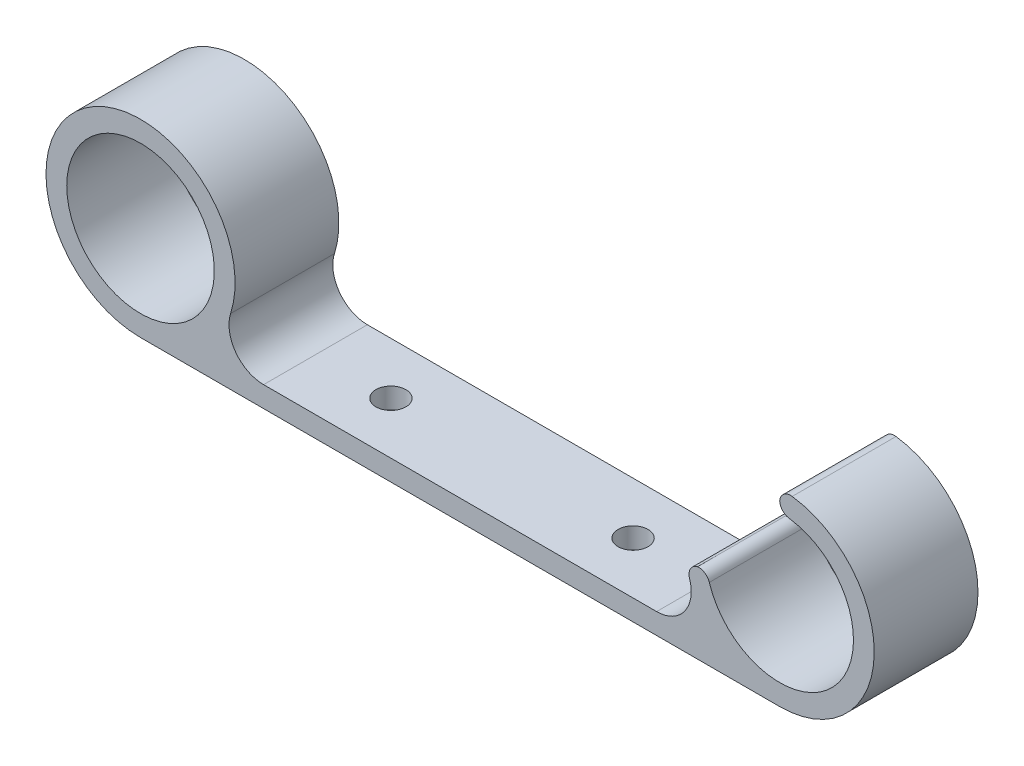
ISO-10303-21;
HEADER;
FILE_DESCRIPTION(('STEP AP214'),'2;1');
FILE_NAME('part.step','',(''),(''),'','','');
FILE_SCHEMA(('AUTOMOTIVE_DESIGN { 1 0 10303 214 1 1 1 1 }'));
ENDSEC;
DATA;
#1=APPLICATION_CONTEXT('core data for automotive mechanical design processes');
#2=APPLICATION_PROTOCOL_DEFINITION('international standard','automotive_design',2000,#1);
#3=PRODUCT_CONTEXT('',#1,'mechanical');
#4=PRODUCT('Part','Part','',(#3));
#5=PRODUCT_RELATED_PRODUCT_CATEGORY('part','',(#4));
#6=PRODUCT_DEFINITION_FORMATION('','',#4);
#7=PRODUCT_DEFINITION_CONTEXT('part definition',#1,'design');
#8=PRODUCT_DEFINITION('design','',#6,#7);
#9=PRODUCT_DEFINITION_SHAPE('','',#8);
#10=(LENGTH_UNIT() NAMED_UNIT(*) SI_UNIT(.MILLI.,.METRE.));
#11=(NAMED_UNIT(*) PLANE_ANGLE_UNIT() SI_UNIT($,.RADIAN.));
#12=(NAMED_UNIT(*) SI_UNIT($,.STERADIAN.) SOLID_ANGLE_UNIT());
#13=UNCERTAINTY_MEASURE_WITH_UNIT(LENGTH_MEASURE(1.E-05),#10,'distance_accuracy_value','');
#14=(GEOMETRIC_REPRESENTATION_CONTEXT(3) GLOBAL_UNCERTAINTY_ASSIGNED_CONTEXT((#13)) GLOBAL_UNIT_ASSIGNED_CONTEXT((#10,
#11,#12)) REPRESENTATION_CONTEXT('',''));
#15=CARTESIAN_POINT('',(0.,0.,0.));
#16=DIRECTION('',(0.,0.,1.));
#17=DIRECTION('',(1.,0.,0.));
#18=AXIS2_PLACEMENT_3D('',#15,#16,#17);
#19=CARTESIAN_POINT('',(58.658787305,17.3553125,9.525));
#20=DIRECTION('',(0.,0.,-1.));
#21=DIRECTION('',(-1.,0.,0.));
#22=AXIS2_PLACEMENT_3D('',#19,#20,#21);
#23=CYLINDRICAL_SURFACE('',#22,17.3553125);
#24=CARTESIAN_POINT('',(58.658787305,17.3553125,-9.525));
#25=DIRECTION('',(0.,0.,1.));
#26=DIRECTION('',(1.,0.,0.));
#27=AXIS2_PLACEMENT_3D('',#24,#25,#26);
#28=CIRCLE('',#27,17.3553125);
#29=CARTESIAN_POINT('',(60.9602475799895,34.5573516981678,-9.525));
#30=VERTEX_POINT('',#29);
#31=CARTESIAN_POINT('',(58.658787305,0.,-9.525));
#32=VERTEX_POINT('',#31);
#33=EDGE_CURVE('E263',#30,#32,#28,.F.);
#34=ORIENTED_EDGE('',*,*,#33,.F.);
#35=DIRECTION('',(0.,0.,-1.));
#36=VECTOR('',#35,1.);
#37=CARTESIAN_POINT('',(60.9602475799895,34.5573516981678,9.525));
#38=LINE('',#37,#36);
#39=CARTESIAN_POINT('',(60.9602475799895,34.5573516981678,9.525));
#40=VERTEX_POINT('',#39);
#41=EDGE_CURVE('E191',#30,#40,#38,.F.);
#42=ORIENTED_EDGE('',*,*,#41,.T.);
#43=CARTESIAN_POINT('',(58.658787305,17.3553125,9.525));
#44=DIRECTION('',(0.,0.,1.));
#45=DIRECTION('',(1.,0.,0.));
#46=AXIS2_PLACEMENT_3D('',#43,#44,#45);
#47=CIRCLE('',#46,17.3553125);
#48=CARTESIAN_POINT('',(58.658787305,0.,9.525));
#49=VERTEX_POINT('',#48);
#50=EDGE_CURVE('E159',#40,#49,#47,.F.);
#51=ORIENTED_EDGE('',*,*,#50,.T.);
#52=DIRECTION('',(0.,0.,-1.));
#53=VECTOR('',#52,1.);
#54=CARTESIAN_POINT('',(58.658787305,0.,9.525));
#55=LINE('',#54,#53);
#56=EDGE_CURVE('E143',#49,#32,#55,.T.);
#57=ORIENTED_EDGE('',*,*,#56,.T.);
#58=EDGE_LOOP('',(#34,#42,#51,#57));
#59=FACE_BOUND('',#58,.T.);
#60=ADVANCED_FACE('F44',(#59),#23,.T.);
#61=CARTESIAN_POINT('',(58.658787305,17.3553125,9.525));
#62=DIRECTION('',(0.,0.,-1.));
#63=DIRECTION('',(-1.,0.,0.));
#64=AXIS2_PLACEMENT_3D('',#61,#62,#63);
#65=CYLINDRICAL_SURFACE('',#64,13.5453125);
#66=CARTESIAN_POINT('',(58.658787305,17.3553125,9.525));
#67=DIRECTION('',(0.,0.,1.));
#68=DIRECTION('',(1.,0.,0.));
#69=AXIS2_PLACEMENT_3D('',#66,#67,#68);
#70=CIRCLE('',#69,13.5453125);
#71=CARTESIAN_POINT('',(45.7400642600769,13.2832017928568,9.525));
#72=VERTEX_POINT('',#71);
#73=CARTESIAN_POINT('',(60.425720785984,30.7848857172111,9.525));
#74=VERTEX_POINT('',#73);
#75=EDGE_CURVE('E243',#72,#74,#70,.T.);
#76=ORIENTED_EDGE('',*,*,#75,.T.);
#77=DIRECTION('',(0.,0.,-1.));
#78=VECTOR('',#77,1.);
#79=CARTESIAN_POINT('',(60.425720785984,30.7848857172111,9.525));
#80=LINE('',#79,#78);
#81=CARTESIAN_POINT('',(60.425720785984,30.7848857172111,-9.525));
#82=VERTEX_POINT('',#81);
#83=EDGE_CURVE('E54',#74,#82,#80,.T.);
#84=ORIENTED_EDGE('',*,*,#83,.T.);
#85=CARTESIAN_POINT('',(58.658787305,17.3553125,-9.525));
#86=DIRECTION('',(0.,0.,1.));
#87=DIRECTION('',(1.,0.,0.));
#88=AXIS2_PLACEMENT_3D('',#85,#86,#87);
#89=CIRCLE('',#88,13.5453125);
#90=CARTESIAN_POINT('',(45.7400642600769,13.2832017928568,-9.525));
#91=VERTEX_POINT('',#90);
#92=EDGE_CURVE('E266',#91,#82,#89,.T.);
#93=ORIENTED_EDGE('',*,*,#92,.F.);
#94=DIRECTION('',(0.,0.,-1.));
#95=VECTOR('',#94,1.);
#96=CARTESIAN_POINT('',(45.7400642600769,13.2832017928568,9.525));
#97=LINE('',#96,#95);
#98=EDGE_CURVE('E205',#91,#72,#97,.F.);
#99=ORIENTED_EDGE('',*,*,#98,.T.);
#100=EDGE_LOOP('',(#76,#84,#93,#99));
#101=FACE_BOUND('',#100,.T.);
#102=ADVANCED_FACE('F315',(#101),#65,.F.);
#103=CARTESIAN_POINT('',(58.658787305,17.3553125,9.525));
#104=DIRECTION('',(0.,0.,-1.));
#105=DIRECTION('',(-1.,0.,0.));
#106=AXIS2_PLACEMENT_3D('',#103,#104,#105);
#107=CYLINDRICAL_SURFACE('',#106,17.3553125);
#108=CARTESIAN_POINT('',(58.658787305,17.3553125,9.525));
#109=DIRECTION('',(0.,0.,1.));
#110=DIRECTION('',(1.,0.,0.));
#111=AXIS2_PLACEMENT_3D('',#108,#109,#110);
#112=CIRCLE('',#111,17.3553125);
#113=CARTESIAN_POINT('',(42.1222748785896,12.0874259461882,9.525));
#114=VERTEX_POINT('',#113);
#115=CARTESIAN_POINT('',(42.1177301177492,12.1017138190237,9.525));
#116=VERTEX_POINT('',#115);
#117=EDGE_CURVE('E247',#114,#116,#112,.F.);
#118=ORIENTED_EDGE('',*,*,#117,.T.);
#119=DIRECTION('',(0.,0.,-1.));
#120=VECTOR('',#119,1.);
#121=CARTESIAN_POINT('',(42.1177301177492,12.1017138190237,9.525));
#122=LINE('',#121,#120);
#123=CARTESIAN_POINT('',(42.1177301177492,12.1017138190237,-9.525));
#124=VERTEX_POINT('',#123);
#125=EDGE_CURVE('E11',#116,#124,#122,.T.);
#126=ORIENTED_EDGE('',*,*,#125,.T.);
#127=CARTESIAN_POINT('',(58.658787305,17.3553125,-9.525));
#128=DIRECTION('',(0.,0.,1.));
#129=DIRECTION('',(1.,0.,0.));
#130=AXIS2_PLACEMENT_3D('',#127,#128,#129);
#131=CIRCLE('',#130,17.3553125);
#132=CARTESIAN_POINT('',(42.1222748785896,12.0874259461882,-9.525));
#133=VERTEX_POINT('',#132);
#134=EDGE_CURVE('E270',#133,#124,#131,.F.);
#135=ORIENTED_EDGE('',*,*,#134,.F.);
#136=DIRECTION('',(0.,0.,-1.));
#137=VECTOR('',#136,1.);
#138=CARTESIAN_POINT('',(42.1222748785896,12.0874259461882,9.525));
#139=LINE('',#138,#137);
#140=EDGE_CURVE('E170',#114,#133,#139,.T.);
#141=ORIENTED_EDGE('',*,*,#140,.F.);
#142=EDGE_LOOP('',(#118,#126,#135,#141));
#143=FACE_BOUND('',#142,.T.);
#144=ADVANCED_FACE('F298',(#143),#107,.T.);
#145=CARTESIAN_POINT('',(36.0718592546874,10.16,9.525));
#146=DIRECTION('',(0.,0.,-1.));
#147=DIRECTION('',(-1.,0.,0.));
#148=AXIS2_PLACEMENT_3D('',#145,#146,#147);
#149=CYLINDRICAL_SURFACE('',#148,6.35);
#150=CARTESIAN_POINT('',(36.0718592546874,10.16,-9.525));
#151=DIRECTION('',(0.,0.,1.));
#152=DIRECTION('',(1.,0.,0.));
#153=AXIS2_PLACEMENT_3D('',#150,#151,#152);
#154=CIRCLE('',#153,6.35);
#155=CARTESIAN_POINT('',(36.0718592546874,3.81,-9.525));
#156=VERTEX_POINT('',#155);
#157=EDGE_CURVE('E274',#156,#133,#154,.T.);
#158=ORIENTED_EDGE('',*,*,#157,.F.);
#159=DIRECTION('',(0.,0.,-1.));
#160=VECTOR('',#159,1.);
#161=CARTESIAN_POINT('',(36.0718592546874,3.81,9.525));
#162=LINE('',#161,#160);
#163=CARTESIAN_POINT('',(36.0718592546874,3.81,9.525));
#164=VERTEX_POINT('',#163);
#165=EDGE_CURVE('E286',#164,#156,#162,.T.);
#166=ORIENTED_EDGE('',*,*,#165,.F.);
#167=CARTESIAN_POINT('',(36.0718592546874,10.16,9.525));
#168=DIRECTION('',(0.,0.,1.));
#169=DIRECTION('',(1.,0.,0.));
#170=AXIS2_PLACEMENT_3D('',#167,#168,#169);
#171=CIRCLE('',#170,6.35);
#172=EDGE_CURVE('E251',#164,#114,#171,.T.);
#173=ORIENTED_EDGE('',*,*,#172,.T.);
#174=ORIENTED_EDGE('',*,*,#140,.T.);
#175=EDGE_LOOP('',(#158,#166,#173,#174));
#176=FACE_BOUND('',#175,.T.);
#177=ADVANCED_FACE('F293',(#176),#149,.F.);
#178=CARTESIAN_POINT('',(0.,3.81,0.));
#179=DIRECTION('',(0.,-1.,0.));
#180=DIRECTION('',(0.,0.,-1.));
#181=AXIS2_PLACEMENT_3D('',#178,#179,#180);
#182=PLANE('',#181);
#183=CARTESIAN_POINT('',(-22.225,3.81,0.));
#184=DIRECTION('',(0.,1.,0.));
#185=DIRECTION('',(0.,0.,1.));
#186=AXIS2_PLACEMENT_3D('',#183,#184,#185);
#187=CIRCLE('',#186,2.75);
#188=CARTESIAN_POINT('',(-22.225,3.81,2.75));
#189=VERTEX_POINT('',#188);
#190=EDGE_CURVE('E222',#189,#189,#187,.T.);
#191=ORIENTED_EDGE('',*,*,#190,.F.);
#192=EDGE_LOOP('',(#191));
#193=FACE_BOUND('',#192,.T.);
#194=CARTESIAN_POINT('',(22.225,3.81,0.));
#195=DIRECTION('',(0.,1.,0.));
#196=DIRECTION('',(0.,0.,-1.));
#197=AXIS2_PLACEMENT_3D('',#194,#195,#196);
#198=CIRCLE('',#197,2.75);
#199=CARTESIAN_POINT('',(22.225,3.81,2.75));
#200=VERTEX_POINT('',#199);
#201=EDGE_CURVE('E229',#200,#200,#198,.T.);
#202=ORIENTED_EDGE('',*,*,#201,.F.);
#203=EDGE_LOOP('',(#202));
#204=FACE_BOUND('',#203,.T.);
#205=ORIENTED_EDGE('',*,*,#165,.T.);
#206=DIRECTION('',(-1.,0.,0.));
#207=VECTOR('',#206,1.);
#208=CARTESIAN_POINT('',(-57.15,3.81,-9.525));
#209=LINE('',#208,#207);
#210=CARTESIAN_POINT('',(-36.0718592546874,3.81,-9.525));
#211=VERTEX_POINT('',#210);
#212=EDGE_CURVE('E145',#156,#211,#209,.T.);
#213=ORIENTED_EDGE('',*,*,#212,.T.);
#214=DIRECTION('',(0.,0.,-1.));
#215=VECTOR('',#214,1.);
#216=CARTESIAN_POINT('',(-36.0718592546874,3.81,9.525));
#217=LINE('',#216,#215);
#218=CARTESIAN_POINT('',(-36.0718592546874,3.81,9.525));
#219=VERTEX_POINT('',#218);
#220=EDGE_CURVE('E282',#219,#211,#217,.T.);
#221=ORIENTED_EDGE('',*,*,#220,.F.);
#222=DIRECTION('',(1.,0.,0.));
#223=VECTOR('',#222,1.);
#224=CARTESIAN_POINT('',(-57.15,3.81,9.525));
#225=LINE('',#224,#223);
#226=EDGE_CURVE('E176',#219,#164,#225,.T.);
#227=ORIENTED_EDGE('',*,*,#226,.T.);
#228=EDGE_LOOP('',(#205,#213,#221,#227));
#229=FACE_BOUND('',#228,.T.);
#230=ADVANCED_FACE('F306',(#193,#204,#229),#182,.F.);
#231=CARTESIAN_POINT('',(-57.15,3.81,-9.525));
#232=DIRECTION('',(0.,0.,1.));
#233=DIRECTION('',(1.,0.,0.));
#234=AXIS2_PLACEMENT_3D('',#231,#232,#233);
#235=PLANE('',#234);
#236=CARTESIAN_POINT('',(60.690787305,32.7995230891708,-9.525));
#237=DIRECTION('',(0.,0.,1.));
#238=DIRECTION('',(1.,0.,0.));
#239=AXIS2_PLACEMENT_3D('',#236,#237,#238);
#240=CIRCLE('',#239,2.032);
#241=CARTESIAN_POINT('',(58.6628299373703,32.6714101894436,-9.525));
#242=VERTEX_POINT('',#241);
#243=EDGE_CURVE('E185',#82,#242,#240,.F.);
#244=ORIENTED_EDGE('',*,*,#243,.T.);
#245=CARTESIAN_POINT('',(60.690787305,32.5432972897164,-9.525));
#246=DIRECTION('',(0.,0.,1.));
#247=DIRECTION('',(1.,0.,0.));
#248=AXIS2_PLACEMENT_3D('',#245,#246,#247);
#249=CIRCLE('',#248,2.032);
#250=EDGE_CURVE('E188',#242,#30,#249,.F.);
#251=ORIENTED_EDGE('',*,*,#250,.T.);
#252=ORIENTED_EDGE('',*,*,#33,.T.);
#253=DIRECTION('',(-1.,0.,0.));
#254=VECTOR('',#253,1.);
#255=CARTESIAN_POINT('',(-57.15,0.,-9.525));
#256=LINE('',#255,#254);
#257=CARTESIAN_POINT('',(-58.658787305,0.,-9.525));
#258=VERTEX_POINT('',#257);
#259=EDGE_CURVE('E146',#32,#258,#256,.T.);
#260=ORIENTED_EDGE('',*,*,#259,.T.);
#261=CARTESIAN_POINT('',(-58.658787305,17.3553125,-9.525));
#262=DIRECTION('',(0.,0.,1.));
#263=DIRECTION('',(1.,0.,0.));
#264=AXIS2_PLACEMENT_3D('',#261,#262,#263);
#265=CIRCLE('',#264,17.3553125);
#266=CARTESIAN_POINT('',(-42.1222748785896,12.0874259461882,-9.525));
#267=VERTEX_POINT('',#266);
#268=EDGE_CURVE('E164',#267,#258,#265,.T.);
#269=ORIENTED_EDGE('',*,*,#268,.F.);
#270=CARTESIAN_POINT('',(-36.0718592546874,10.16,-9.525));
#271=DIRECTION('',(0.,0.,1.));
#272=DIRECTION('',(1.,0.,0.));
#273=AXIS2_PLACEMENT_3D('',#270,#271,#272);
#274=CIRCLE('',#273,6.35);
#275=EDGE_CURVE('E239',#211,#267,#274,.F.);
#276=ORIENTED_EDGE('',*,*,#275,.F.);
#277=ORIENTED_EDGE('',*,*,#212,.F.);
#278=ORIENTED_EDGE('',*,*,#157,.T.);
#279=ORIENTED_EDGE('',*,*,#134,.T.);
#280=CARTESIAN_POINT('',(44.054395228475,12.7168172647118,-9.525));
#281=DIRECTION('',(0.,0.,1.));
#282=DIRECTION('',(1.,0.,0.));
#283=AXIS2_PLACEMENT_3D('',#280,#281,#282);
#284=CIRCLE('',#283,2.032);
#285=CARTESIAN_POINT('',(43.5760775502877,14.6917188315585,-9.525));
#286=VERTEX_POINT('',#285);
#287=EDGE_CURVE('E178',#124,#286,#284,.F.);
#288=ORIENTED_EDGE('',*,*,#287,.T.);
#289=CARTESIAN_POINT('',(43.8020620746505,12.6723241215653,-9.525));
#290=DIRECTION('',(0.,0.,1.));
#291=DIRECTION('',(1.,0.,0.));
#292=AXIS2_PLACEMENT_3D('',#289,#290,#291);
#293=CIRCLE('',#292,2.032);
#294=EDGE_CURVE('E182',#286,#91,#293,.F.);
#295=ORIENTED_EDGE('',*,*,#294,.T.);
#296=ORIENTED_EDGE('',*,*,#92,.T.);
#297=EDGE_LOOP('',(#244,#251,#252,#260,#269,#276,#277,#278,#279,#288,#295,#296));
#298=FACE_BOUND('',#297,.T.);
#299=CARTESIAN_POINT('',(-58.658787305,17.3553125,-9.525));
#300=DIRECTION('',(0.,0.,1.));
#301=DIRECTION('',(1.,0.,0.));
#302=AXIS2_PLACEMENT_3D('',#299,#300,#301);
#303=CIRCLE('',#302,13.5453125);
#304=CARTESIAN_POINT('',(-72.204099805,17.3553125,-9.525));
#305=VERTEX_POINT('',#304);
#306=EDGE_CURVE('E215',#305,#305,#303,.T.);
#307=ORIENTED_EDGE('',*,*,#306,.T.);
#308=EDGE_LOOP('',(#307));
#309=FACE_BOUND('',#308,.T.);
#310=ADVANCED_FACE('F302',(#298,#309),#235,.F.);
#311=CARTESIAN_POINT('',(-57.15,3.81,9.525));
#312=DIRECTION('',(0.,0.,-1.));
#313=DIRECTION('',(-1.,0.,0.));
#314=AXIS2_PLACEMENT_3D('',#311,#312,#313);
#315=PLANE('',#314);
#316=ORIENTED_EDGE('',*,*,#50,.F.);
#317=CARTESIAN_POINT('',(60.690787305,32.5432972897164,9.525));
#318=DIRECTION('',(0.,0.,-1.));
#319=DIRECTION('',(-1.,0.,0.));
#320=AXIS2_PLACEMENT_3D('',#317,#318,#319);
#321=CIRCLE('',#320,2.032);
#322=CARTESIAN_POINT('',(58.6628299373703,32.6714101894436,9.525));
#323=VERTEX_POINT('',#322);
#324=EDGE_CURVE('E62',#40,#323,#321,.F.);
#325=ORIENTED_EDGE('',*,*,#324,.T.);
#326=CARTESIAN_POINT('',(60.690787305,32.7995230891708,9.525));
#327=DIRECTION('',(0.,0.,-1.));
#328=DIRECTION('',(-1.,0.,0.));
#329=AXIS2_PLACEMENT_3D('',#326,#327,#328);
#330=CIRCLE('',#329,2.032);
#331=EDGE_CURVE('E200',#323,#74,#330,.F.);
#332=ORIENTED_EDGE('',*,*,#331,.T.);
#333=ORIENTED_EDGE('',*,*,#75,.F.);
#334=CARTESIAN_POINT('',(43.8020620746505,12.6723241215653,9.525));
#335=DIRECTION('',(0.,0.,-1.));
#336=DIRECTION('',(-1.,0.,0.));
#337=AXIS2_PLACEMENT_3D('',#334,#335,#336);
#338=CIRCLE('',#337,2.032);
#339=CARTESIAN_POINT('',(43.5760775502877,14.6917188315585,9.525));
#340=VERTEX_POINT('',#339);
#341=EDGE_CURVE('E69',#72,#340,#338,.F.);
#342=ORIENTED_EDGE('',*,*,#341,.T.);
#343=CARTESIAN_POINT('',(44.054395228475,12.7168172647118,9.525));
#344=DIRECTION('',(0.,0.,-1.));
#345=DIRECTION('',(-1.,0.,0.));
#346=AXIS2_PLACEMENT_3D('',#343,#344,#345);
#347=CIRCLE('',#346,2.032);
#348=EDGE_CURVE('E195',#340,#116,#347,.F.);
#349=ORIENTED_EDGE('',*,*,#348,.T.);
#350=ORIENTED_EDGE('',*,*,#117,.F.);
#351=ORIENTED_EDGE('',*,*,#172,.F.);
#352=ORIENTED_EDGE('',*,*,#226,.F.);
#353=CARTESIAN_POINT('',(-36.0718592546874,10.16,9.525));
#354=DIRECTION('',(0.,0.,1.));
#355=DIRECTION('',(1.,0.,0.));
#356=AXIS2_PLACEMENT_3D('',#353,#354,#355);
#357=CIRCLE('',#356,6.35);
#358=CARTESIAN_POINT('',(-42.1222748785896,12.0874259461882,9.525));
#359=VERTEX_POINT('',#358);
#360=EDGE_CURVE('E154',#219,#359,#357,.F.);
#361=ORIENTED_EDGE('',*,*,#360,.T.);
#362=CARTESIAN_POINT('',(-58.658787305,17.3553125,9.525));
#363=DIRECTION('',(0.,0.,1.));
#364=DIRECTION('',(1.,0.,0.));
#365=AXIS2_PLACEMENT_3D('',#362,#363,#364);
#366=CIRCLE('',#365,17.3553125);
#367=CARTESIAN_POINT('',(-58.658787305,0.,9.525));
#368=VERTEX_POINT('',#367);
#369=EDGE_CURVE('E149',#359,#368,#366,.T.);
#370=ORIENTED_EDGE('',*,*,#369,.T.);
#371=DIRECTION('',(1.,0.,0.));
#372=VECTOR('',#371,1.);
#373=CARTESIAN_POINT('',(-57.15,0.,9.525));
#374=LINE('',#373,#372);
#375=EDGE_CURVE('E135',#368,#49,#374,.T.);
#376=ORIENTED_EDGE('',*,*,#375,.T.);
#377=EDGE_LOOP('',(#316,#325,#332,#333,#342,#349,#350,#351,#352,#361,#370,#376));
#378=FACE_BOUND('',#377,.T.);
#379=CARTESIAN_POINT('',(-58.658787305,17.3553125,9.525));
#380=DIRECTION('',(0.,0.,1.));
#381=DIRECTION('',(1.,0.,0.));
#382=AXIS2_PLACEMENT_3D('',#379,#380,#381);
#383=CIRCLE('',#382,13.5453125);
#384=CARTESIAN_POINT('',(-72.204099805,17.3553125,9.525));
#385=VERTEX_POINT('',#384);
#386=EDGE_CURVE('E160',#385,#385,#383,.T.);
#387=ORIENTED_EDGE('',*,*,#386,.F.);
#388=EDGE_LOOP('',(#387));
#389=FACE_BOUND('',#388,.T.);
#390=ADVANCED_FACE('F150',(#378,#389),#315,.F.);
#391=CARTESIAN_POINT('',(0.,0.,0.));
#392=DIRECTION('',(0.,-1.,0.));
#393=DIRECTION('',(0.,0.,-1.));
#394=AXIS2_PLACEMENT_3D('',#391,#392,#393);
#395=PLANE('',#394);
#396=CARTESIAN_POINT('',(-22.225,0.,0.));
#397=DIRECTION('',(0.,-1.,0.));
#398=DIRECTION('',(0.,0.,-1.));
#399=AXIS2_PLACEMENT_3D('',#396,#397,#398);
#400=CIRCLE('',#399,2.75);
#401=CARTESIAN_POINT('',(-22.225,0.,2.75));
#402=VERTEX_POINT('',#401);
#403=EDGE_CURVE('E48',#402,#402,#400,.T.);
#404=ORIENTED_EDGE('',*,*,#403,.F.);
#405=EDGE_LOOP('',(#404));
#406=FACE_BOUND('',#405,.T.);
#407=CARTESIAN_POINT('',(22.225,0.,0.));
#408=DIRECTION('',(0.,-1.,0.));
#409=DIRECTION('',(0.,0.,-1.));
#410=AXIS2_PLACEMENT_3D('',#407,#408,#409);
#411=CIRCLE('',#410,2.75);
#412=CARTESIAN_POINT('',(22.225,0.,2.75));
#413=VERTEX_POINT('',#412);
#414=EDGE_CURVE('E219',#413,#413,#411,.T.);
#415=ORIENTED_EDGE('',*,*,#414,.F.);
#416=EDGE_LOOP('',(#415));
#417=FACE_BOUND('',#416,.T.);
#418=ORIENTED_EDGE('',*,*,#259,.F.);
#419=ORIENTED_EDGE('',*,*,#56,.F.);
#420=ORIENTED_EDGE('',*,*,#375,.F.);
#421=DIRECTION('',(0.,0.,-1.));
#422=VECTOR('',#421,1.);
#423=CARTESIAN_POINT('',(-58.658787305,0.,9.525));
#424=LINE('',#423,#422);
#425=EDGE_CURVE('E140',#368,#258,#424,.T.);
#426=ORIENTED_EDGE('',*,*,#425,.T.);
#427=EDGE_LOOP('',(#418,#419,#420,#426));
#428=FACE_BOUND('',#427,.T.);
#429=ADVANCED_FACE('F138',(#406,#417,#428),#395,.T.);
#430=CARTESIAN_POINT('',(-58.658787305,17.3553125,9.525));
#431=DIRECTION('',(0.,0.,-1.));
#432=DIRECTION('',(-1.,0.,0.));
#433=AXIS2_PLACEMENT_3D('',#430,#431,#432);
#434=CYLINDRICAL_SURFACE('',#433,17.3553125);
#435=ORIENTED_EDGE('',*,*,#268,.T.);
#436=ORIENTED_EDGE('',*,*,#425,.F.);
#437=ORIENTED_EDGE('',*,*,#369,.F.);
#438=DIRECTION('',(0.,0.,-1.));
#439=VECTOR('',#438,1.);
#440=CARTESIAN_POINT('',(-42.1222748785896,12.0874259461882,9.525));
#441=LINE('',#440,#439);
#442=EDGE_CURVE('E257',#359,#267,#441,.T.);
#443=ORIENTED_EDGE('',*,*,#442,.T.);
#444=EDGE_LOOP('',(#435,#436,#437,#443));
#445=FACE_BOUND('',#444,.T.);
#446=ADVANCED_FACE('F162',(#445),#434,.T.);
#447=CARTESIAN_POINT('',(-58.658787305,17.3553125,9.525));
#448=DIRECTION('',(0.,0.,-1.));
#449=DIRECTION('',(-1.,0.,0.));
#450=AXIS2_PLACEMENT_3D('',#447,#448,#449);
#451=CYLINDRICAL_SURFACE('',#450,13.5453125);
#452=CARTESIAN_POINT('',(-72.204099805,17.3553125,9.525));
#453=CARTESIAN_POINT('',(-72.204099805,17.3553125,9.3265625));
#454=CARTESIAN_POINT('',(-72.204099805,17.3553125,9.128125));
#455=CARTESIAN_POINT('',(-72.204099805,17.3553125,8.73125));
#456=CARTESIAN_POINT('',(-72.204099805,17.3553125,8.5328125));
#457=CARTESIAN_POINT('',(-72.204099805,17.3553125,8.1359375));
#458=CARTESIAN_POINT('',(-72.204099805,17.3553125,7.9375));
#459=CARTESIAN_POINT('',(-72.204099805,17.3553125,7.540625));
#460=CARTESIAN_POINT('',(-72.204099805,17.3553125,7.3421875));
#461=CARTESIAN_POINT('',(-72.204099805,17.3553125,6.9453125));
#462=CARTESIAN_POINT('',(-72.204099805,17.3553125,6.746875));
#463=CARTESIAN_POINT('',(-72.204099805,17.3553125,6.35));
#464=CARTESIAN_POINT('',(-72.204099805,17.3553125,6.1515625));
#465=CARTESIAN_POINT('',(-72.204099805,17.3553125,5.7546875));
#466=CARTESIAN_POINT('',(-72.204099805,17.3553125,5.55625));
#467=CARTESIAN_POINT('',(-72.204099805,17.3553125,5.159375));
#468=CARTESIAN_POINT('',(-72.204099805,17.3553125,4.9609375));
#469=CARTESIAN_POINT('',(-72.204099805,17.3553125,4.5640625));
#470=CARTESIAN_POINT('',(-72.204099805,17.3553125,4.365625));
#471=CARTESIAN_POINT('',(-72.204099805,17.3553125,3.96875));
#472=CARTESIAN_POINT('',(-72.204099805,17.3553125,3.7703125));
#473=CARTESIAN_POINT('',(-72.204099805,17.3553125,3.3734375));
#474=CARTESIAN_POINT('',(-72.204099805,17.3553125,3.175));
#475=CARTESIAN_POINT('',(-72.204099805,17.3553125,2.778125));
#476=CARTESIAN_POINT('',(-72.204099805,17.3553125,2.5796875));
#477=CARTESIAN_POINT('',(-72.204099805,17.3553125,2.1828125));
#478=CARTESIAN_POINT('',(-72.204099805,17.3553125,1.984375));
#479=CARTESIAN_POINT('',(-72.204099805,17.3553125,1.5875));
#480=CARTESIAN_POINT('',(-72.204099805,17.3553125,1.3890625));
#481=CARTESIAN_POINT('',(-72.204099805,17.3553125,0.992187500000001));
#482=CARTESIAN_POINT('',(-72.204099805,17.3553125,0.793750000000001));
#483=CARTESIAN_POINT('',(-72.204099805,17.3553125,0.396875));
#484=CARTESIAN_POINT('',(-72.204099805,17.3553125,0.1984375));
#485=CARTESIAN_POINT('',(-72.204099805,17.3553125,-0.1984375));
#486=CARTESIAN_POINT('',(-72.204099805,17.3553125,-0.396875));
#487=CARTESIAN_POINT('',(-72.204099805,17.3553125,-0.793750000000001));
#488=CARTESIAN_POINT('',(-72.204099805,17.3553125,-0.992187500000001));
#489=CARTESIAN_POINT('',(-72.204099805,17.3553125,-1.3890625));
#490=CARTESIAN_POINT('',(-72.204099805,17.3553125,-1.5875));
#491=CARTESIAN_POINT('',(-72.204099805,17.3553125,-1.984375));
#492=CARTESIAN_POINT('',(-72.204099805,17.3553125,-2.1828125));
#493=CARTESIAN_POINT('',(-72.204099805,17.3553125,-2.5796875));
#494=CARTESIAN_POINT('',(-72.204099805,17.3553125,-2.778125));
#495=CARTESIAN_POINT('',(-72.204099805,17.3553125,-3.175));
#496=CARTESIAN_POINT('',(-72.204099805,17.3553125,-3.3734375));
#497=CARTESIAN_POINT('',(-72.204099805,17.3553125,-3.7703125));
#498=CARTESIAN_POINT('',(-72.204099805,17.3553125,-3.96875));
#499=CARTESIAN_POINT('',(-72.204099805,17.3553125,-4.365625));
#500=CARTESIAN_POINT('',(-72.204099805,17.3553125,-4.5640625));
#501=CARTESIAN_POINT('',(-72.204099805,17.3553125,-4.9609375));
#502=CARTESIAN_POINT('',(-72.204099805,17.3553125,-5.159375));
#503=CARTESIAN_POINT('',(-72.204099805,17.3553125,-5.55625));
#504=CARTESIAN_POINT('',(-72.204099805,17.3553125,-5.7546875));
#505=CARTESIAN_POINT('',(-72.204099805,17.3553125,-6.1515625));
#506=CARTESIAN_POINT('',(-72.204099805,17.3553125,-6.35));
#507=CARTESIAN_POINT('',(-72.204099805,17.3553125,-6.746875));
#508=CARTESIAN_POINT('',(-72.204099805,17.3553125,-6.9453125));
#509=CARTESIAN_POINT('',(-72.204099805,17.3553125,-7.3421875));
#510=CARTESIAN_POINT('',(-72.204099805,17.3553125,-7.540625));
#511=CARTESIAN_POINT('',(-72.204099805,17.3553125,-7.9375));
#512=CARTESIAN_POINT('',(-72.204099805,17.3553125,-8.1359375));
#513=CARTESIAN_POINT('',(-72.204099805,17.3553125,-8.5328125));
#514=CARTESIAN_POINT('',(-72.204099805,17.3553125,-8.73125));
#515=CARTESIAN_POINT('',(-72.204099805,17.3553125,-9.128125));
#516=CARTESIAN_POINT('',(-72.204099805,17.3553125,-9.3265625));
#517=CARTESIAN_POINT('',(-72.204099805,17.3553125,-9.525));
#518=B_SPLINE_CURVE_WITH_KNOTS('',3,(#452,#453,#454,#455,#456,#457,#458,#459,#460,#461,#462,
#463,#464,#465,#466,#467,#468,#469,#470,#471,#472,#473,#474,#475,#476,#477,#478,#479,#480,#481,
#482,#483,#484,#485,#486,#487,#488,#489,#490,#491,#492,#493,#494,#495,#496,#497,#498,#499,#500,
#501,#502,#503,#504,#505,#506,#507,#508,#509,#510,#511,#512,#513,#514,#515,#516,#517),
.UNSPECIFIED.,.F.,.F.,(4,2,2,2,2,2,2,2,2,2,2,2,2,2,2,2,2,2,2,2,2,2,2,2,2,2,2,2,2,2,2,2,4),(0.,
0.5953125,1.190625,1.7859375,2.38125,2.9765625,3.571875,4.1671875,4.7625,5.3578125,5.953125,
6.5484375,7.14375,7.7390625,8.334375,8.9296875,9.525,10.1203125,10.715625,11.3109375,11.90625,
12.5015625,13.096875,13.6921875,14.2875,14.8828125,15.478125,16.0734375,16.66875,17.2640625,
17.859375,18.4546875,19.05),.UNSPECIFIED.);
#519=EDGE_CURVE('BSEAM340',#385,#305,#518,.T.);
#520=ORIENTED_EDGE('',*,*,#386,.T.);
#521=ORIENTED_EDGE('',*,*,#306,.F.);
#522=ORIENTED_EDGE('',*,*,#519,.T.);
#523=ORIENTED_EDGE('',*,*,#519,.F.);
#524=EDGE_LOOP('',(#520,#522,#521,#523));
#525=FACE_BOUND('',#524,.T.);
#526=ADVANCED_FACE('F340',(#525),#451,.F.);
#527=CARTESIAN_POINT('',(-36.0718592546874,10.16,9.525));
#528=DIRECTION('',(0.,0.,-1.));
#529=DIRECTION('',(-1.,0.,0.));
#530=AXIS2_PLACEMENT_3D('',#527,#528,#529);
#531=CYLINDRICAL_SURFACE('',#530,6.35);
#532=ORIENTED_EDGE('',*,*,#275,.T.);
#533=ORIENTED_EDGE('',*,*,#442,.F.);
#534=ORIENTED_EDGE('',*,*,#360,.F.);
#535=ORIENTED_EDGE('',*,*,#220,.T.);
#536=EDGE_LOOP('',(#532,#533,#534,#535));
#537=FACE_BOUND('',#536,.T.);
#538=ADVANCED_FACE('F343',(#537),#531,.F.);
#539=CARTESIAN_POINT('',(60.690787305,32.7995230891708,9.525));
#540=DIRECTION('',(0.,0.,-1.));
#541=DIRECTION('',(-1.,0.,0.));
#542=AXIS2_PLACEMENT_3D('',#539,#540,#541);
#543=CYLINDRICAL_SURFACE('',#542,2.032);
#544=ORIENTED_EDGE('',*,*,#83,.F.);
#545=ORIENTED_EDGE('',*,*,#331,.F.);
#546=DIRECTION('',(0.,0.,-1.));
#547=VECTOR('',#546,1.);
#548=CARTESIAN_POINT('',(58.6628299373703,32.6714101894436,0.));
#549=LINE('',#548,#547);
#550=EDGE_CURVE('E211',#242,#323,#549,.F.);
#551=ORIENTED_EDGE('',*,*,#550,.F.);
#552=ORIENTED_EDGE('',*,*,#243,.F.);
#553=EDGE_LOOP('',(#544,#545,#551,#552));
#554=FACE_BOUND('',#553,.T.);
#555=ADVANCED_FACE('F356',(#554),#543,.T.);
#556=CARTESIAN_POINT('',(60.690787305,32.5432972897164,9.525));
#557=DIRECTION('',(0.,0.,-1.));
#558=DIRECTION('',(-1.,0.,0.));
#559=AXIS2_PLACEMENT_3D('',#556,#557,#558);
#560=CYLINDRICAL_SURFACE('',#559,2.032);
#561=ORIENTED_EDGE('',*,*,#324,.F.);
#562=ORIENTED_EDGE('',*,*,#41,.F.);
#563=ORIENTED_EDGE('',*,*,#250,.F.);
#564=ORIENTED_EDGE('',*,*,#550,.T.);
#565=EDGE_LOOP('',(#561,#562,#563,#564));
#566=FACE_BOUND('',#565,.T.);
#567=ADVANCED_FACE('F326',(#566),#560,.T.);
#568=CARTESIAN_POINT('',(44.054395228475,12.7168172647118,9.525));
#569=DIRECTION('',(0.,0.,-1.));
#570=DIRECTION('',(-1.,0.,0.));
#571=AXIS2_PLACEMENT_3D('',#568,#569,#570);
#572=CYLINDRICAL_SURFACE('',#571,2.032);
#573=ORIENTED_EDGE('',*,*,#125,.F.);
#574=ORIENTED_EDGE('',*,*,#348,.F.);
#575=DIRECTION('',(0.,0.,-1.));
#576=VECTOR('',#575,1.);
#577=CARTESIAN_POINT('',(43.5760775502877,14.6917188315585,0.));
#578=LINE('',#577,#576);
#579=EDGE_CURVE('E216',#286,#340,#578,.F.);
#580=ORIENTED_EDGE('',*,*,#579,.F.);
#581=ORIENTED_EDGE('',*,*,#287,.F.);
#582=EDGE_LOOP('',(#573,#574,#580,#581));
#583=FACE_BOUND('',#582,.T.);
#584=ADVANCED_FACE('F46',(#583),#572,.T.);
#585=CARTESIAN_POINT('',(43.8020620746505,12.6723241215653,9.525));
#586=DIRECTION('',(0.,0.,-1.));
#587=DIRECTION('',(-1.,0.,0.));
#588=AXIS2_PLACEMENT_3D('',#585,#586,#587);
#589=CYLINDRICAL_SURFACE('',#588,2.032);
#590=ORIENTED_EDGE('',*,*,#341,.F.);
#591=ORIENTED_EDGE('',*,*,#98,.F.);
#592=ORIENTED_EDGE('',*,*,#294,.F.);
#593=ORIENTED_EDGE('',*,*,#579,.T.);
#594=EDGE_LOOP('',(#590,#591,#592,#593));
#595=FACE_BOUND('',#594,.T.);
#596=ADVANCED_FACE('F317',(#595),#589,.T.);
#597=CARTESIAN_POINT('',(22.225,-8.89,0.));
#598=DIRECTION('',(0.,1.,0.));
#599=DIRECTION('',(0.,0.,1.));
#600=AXIS2_PLACEMENT_3D('',#597,#598,#599);
#601=CYLINDRICAL_SURFACE('',#600,2.75);
#602=CARTESIAN_POINT('',(22.225,0.,2.75));
#603=CARTESIAN_POINT('',(22.225,0.0396875000000016,2.75));
#604=CARTESIAN_POINT('',(22.225,0.0793750000000013,2.75));
#605=CARTESIAN_POINT('',(22.225,0.158750000000001,2.75));
#606=CARTESIAN_POINT('',(22.225,0.198437500000002,2.75));
#607=CARTESIAN_POINT('',(22.225,0.277812500000002,2.75));
#608=CARTESIAN_POINT('',(22.225,0.317500000000002,2.75));
#609=CARTESIAN_POINT('',(22.225,0.396875000000001,2.75));
#610=CARTESIAN_POINT('',(22.225,0.436562500000001,2.75));
#611=CARTESIAN_POINT('',(22.225,0.515937500000001,2.75));
#612=CARTESIAN_POINT('',(22.225,0.555625000000002,2.75));
#613=CARTESIAN_POINT('',(22.225,0.635000000000002,2.75));
#614=CARTESIAN_POINT('',(22.225,0.674687500000002,2.75));
#615=CARTESIAN_POINT('',(22.225,0.754062500000001,2.75));
#616=CARTESIAN_POINT('',(22.225,0.793750000000001,2.75));
#617=CARTESIAN_POINT('',(22.225,0.873125000000001,2.75));
#618=CARTESIAN_POINT('',(22.225,0.9128125,2.75));
#619=CARTESIAN_POINT('',(22.225,0.992187500000001,2.75));
#620=CARTESIAN_POINT('',(22.225,1.031875,2.75));
#621=CARTESIAN_POINT('',(22.225,1.11125,2.75));
#622=CARTESIAN_POINT('',(22.225,1.1509375,2.75));
#623=CARTESIAN_POINT('',(22.225,1.2303125,2.75));
#624=CARTESIAN_POINT('',(22.225,1.27,2.75));
#625=CARTESIAN_POINT('',(22.225,1.349375,2.75));
#626=CARTESIAN_POINT('',(22.225,1.3890625,2.75));
#627=CARTESIAN_POINT('',(22.225,1.4684375,2.75));
#628=CARTESIAN_POINT('',(22.225,1.508125,2.75));
#629=CARTESIAN_POINT('',(22.225,1.5875,2.75));
#630=CARTESIAN_POINT('',(22.225,1.6271875,2.75));
#631=CARTESIAN_POINT('',(22.225,1.7065625,2.75));
#632=CARTESIAN_POINT('',(22.225,1.74625,2.75));
#633=CARTESIAN_POINT('',(22.225,1.825625,2.75));
#634=CARTESIAN_POINT('',(22.225,1.8653125,2.75));
#635=CARTESIAN_POINT('',(22.225,1.9446875,2.75));
#636=CARTESIAN_POINT('',(22.225,1.984375,2.75));
#637=CARTESIAN_POINT('',(22.225,2.06375,2.75));
#638=CARTESIAN_POINT('',(22.225,2.1034375,2.75));
#639=CARTESIAN_POINT('',(22.225,2.1828125,2.75));
#640=CARTESIAN_POINT('',(22.225,2.2225,2.75));
#641=CARTESIAN_POINT('',(22.225,2.301875,2.75));
#642=CARTESIAN_POINT('',(22.225,2.3415625,2.75));
#643=CARTESIAN_POINT('',(22.225,2.4209375,2.75));
#644=CARTESIAN_POINT('',(22.225,2.460625,2.75));
#645=CARTESIAN_POINT('',(22.225,2.54,2.75));
#646=CARTESIAN_POINT('',(22.225,2.5796875,2.75));
#647=CARTESIAN_POINT('',(22.225,2.6590625,2.75));
#648=CARTESIAN_POINT('',(22.225,2.69875,2.75));
#649=CARTESIAN_POINT('',(22.225,2.778125,2.75));
#650=CARTESIAN_POINT('',(22.225,2.8178125,2.75));
#651=CARTESIAN_POINT('',(22.225,2.8971875,2.75));
#652=CARTESIAN_POINT('',(22.225,2.936875,2.75));
#653=CARTESIAN_POINT('',(22.225,3.01625,2.75));
#654=CARTESIAN_POINT('',(22.225,3.0559375,2.75));
#655=CARTESIAN_POINT('',(22.225,3.1353125,2.75));
#656=CARTESIAN_POINT('',(22.225,3.175,2.75));
#657=CARTESIAN_POINT('',(22.225,3.254375,2.75));
#658=CARTESIAN_POINT('',(22.225,3.2940625,2.75));
#659=CARTESIAN_POINT('',(22.225,3.3734375,2.75));
#660=CARTESIAN_POINT('',(22.225,3.413125,2.75));
#661=CARTESIAN_POINT('',(22.225,3.4925,2.75));
#662=CARTESIAN_POINT('',(22.225,3.5321875,2.75));
#663=CARTESIAN_POINT('',(22.225,3.6115625,2.75));
#664=CARTESIAN_POINT('',(22.225,3.65125,2.75));
#665=CARTESIAN_POINT('',(22.225,3.730625,2.75));
#666=CARTESIAN_POINT('',(22.225,3.7703125,2.75));
#667=CARTESIAN_POINT('',(22.225,3.81,2.75));
#668=B_SPLINE_CURVE_WITH_KNOTS('',3,(#602,#603,#604,#605,#606,#607,#608,#609,#610,#611,#612,
#613,#614,#615,#616,#617,#618,#619,#620,#621,#622,#623,#624,#625,#626,#627,#628,#629,#630,#631,
#632,#633,#634,#635,#636,#637,#638,#639,#640,#641,#642,#643,#644,#645,#646,#647,#648,#649,#650,
#651,#652,#653,#654,#655,#656,#657,#658,#659,#660,#661,#662,#663,#664,#665,#666,#667),
.UNSPECIFIED.,.F.,.F.,(4,2,2,2,2,2,2,2,2,2,2,2,2,2,2,2,2,2,2,2,2,2,2,2,2,2,2,2,2,2,2,2,4),(0.,
0.119062499999999,0.238125,0.3571875,0.476249999999999,0.5953125,0.714375,0.833437499999999,
0.952499999999998,1.0715625,1.190625,1.3096875,1.42875,1.5478125,1.666875,1.7859375,1.905,
2.0240625,2.143125,2.2621875,2.38125,2.5003125,2.619375,2.7384375,2.8575,2.9765625,3.095625,
3.2146875,3.33375,3.4528125,3.571875,3.6909375,3.81),.UNSPECIFIED.);
#669=EDGE_CURVE('BSEAM319',#413,#200,#668,.T.);
#670=ORIENTED_EDGE('',*,*,#414,.T.);
#671=ORIENTED_EDGE('',*,*,#201,.T.);
#672=ORIENTED_EDGE('',*,*,#669,.T.);
#673=ORIENTED_EDGE('',*,*,#669,.F.);
#674=EDGE_LOOP('',(#670,#672,#671,#673));
#675=FACE_BOUND('',#674,.T.);
#676=ADVANCED_FACE('F319',(#675),#601,.F.);
#677=CARTESIAN_POINT('',(-22.225,-8.89,0.));
#678=DIRECTION('',(0.,1.,0.));
#679=DIRECTION('',(0.,0.,1.));
#680=AXIS2_PLACEMENT_3D('',#677,#678,#679);
#681=CYLINDRICAL_SURFACE('',#680,2.75);
#682=CARTESIAN_POINT('',(-22.225,0.,2.75));
#683=CARTESIAN_POINT('',(-22.225,0.0396875000000016,2.75));
#684=CARTESIAN_POINT('',(-22.225,0.0793750000000013,2.75));
#685=CARTESIAN_POINT('',(-22.225,0.158750000000001,2.75));
#686=CARTESIAN_POINT('',(-22.225,0.198437500000002,2.75));
#687=CARTESIAN_POINT('',(-22.225,0.277812500000002,2.75));
#688=CARTESIAN_POINT('',(-22.225,0.317500000000002,2.75));
#689=CARTESIAN_POINT('',(-22.225,0.396875000000001,2.75));
#690=CARTESIAN_POINT('',(-22.225,0.436562500000001,2.75));
#691=CARTESIAN_POINT('',(-22.225,0.515937500000001,2.75));
#692=CARTESIAN_POINT('',(-22.225,0.555625000000002,2.75));
#693=CARTESIAN_POINT('',(-22.225,0.635000000000002,2.75));
#694=CARTESIAN_POINT('',(-22.225,0.674687500000002,2.75));
#695=CARTESIAN_POINT('',(-22.225,0.754062500000001,2.75));
#696=CARTESIAN_POINT('',(-22.225,0.793750000000001,2.75));
#697=CARTESIAN_POINT('',(-22.225,0.873125000000001,2.75));
#698=CARTESIAN_POINT('',(-22.225,0.9128125,2.75));
#699=CARTESIAN_POINT('',(-22.225,0.992187500000001,2.75));
#700=CARTESIAN_POINT('',(-22.225,1.031875,2.75));
#701=CARTESIAN_POINT('',(-22.225,1.11125,2.75));
#702=CARTESIAN_POINT('',(-22.225,1.1509375,2.75));
#703=CARTESIAN_POINT('',(-22.225,1.2303125,2.75));
#704=CARTESIAN_POINT('',(-22.225,1.27,2.75));
#705=CARTESIAN_POINT('',(-22.225,1.349375,2.75));
#706=CARTESIAN_POINT('',(-22.225,1.3890625,2.75));
#707=CARTESIAN_POINT('',(-22.225,1.4684375,2.75));
#708=CARTESIAN_POINT('',(-22.225,1.508125,2.75));
#709=CARTESIAN_POINT('',(-22.225,1.5875,2.75));
#710=CARTESIAN_POINT('',(-22.225,1.6271875,2.75));
#711=CARTESIAN_POINT('',(-22.225,1.7065625,2.75));
#712=CARTESIAN_POINT('',(-22.225,1.74625,2.75));
#713=CARTESIAN_POINT('',(-22.225,1.825625,2.75));
#714=CARTESIAN_POINT('',(-22.225,1.8653125,2.75));
#715=CARTESIAN_POINT('',(-22.225,1.9446875,2.75));
#716=CARTESIAN_POINT('',(-22.225,1.984375,2.75));
#717=CARTESIAN_POINT('',(-22.225,2.06375,2.75));
#718=CARTESIAN_POINT('',(-22.225,2.1034375,2.75));
#719=CARTESIAN_POINT('',(-22.225,2.1828125,2.75));
#720=CARTESIAN_POINT('',(-22.225,2.2225,2.75));
#721=CARTESIAN_POINT('',(-22.225,2.301875,2.75));
#722=CARTESIAN_POINT('',(-22.225,2.3415625,2.75));
#723=CARTESIAN_POINT('',(-22.225,2.4209375,2.75));
#724=CARTESIAN_POINT('',(-22.225,2.460625,2.75));
#725=CARTESIAN_POINT('',(-22.225,2.54,2.75));
#726=CARTESIAN_POINT('',(-22.225,2.5796875,2.75));
#727=CARTESIAN_POINT('',(-22.225,2.6590625,2.75));
#728=CARTESIAN_POINT('',(-22.225,2.69875,2.75));
#729=CARTESIAN_POINT('',(-22.225,2.778125,2.75));
#730=CARTESIAN_POINT('',(-22.225,2.8178125,2.75));
#731=CARTESIAN_POINT('',(-22.225,2.8971875,2.75));
#732=CARTESIAN_POINT('',(-22.225,2.936875,2.75));
#733=CARTESIAN_POINT('',(-22.225,3.01625,2.75));
#734=CARTESIAN_POINT('',(-22.225,3.0559375,2.75));
#735=CARTESIAN_POINT('',(-22.225,3.1353125,2.75));
#736=CARTESIAN_POINT('',(-22.225,3.175,2.75));
#737=CARTESIAN_POINT('',(-22.225,3.254375,2.75));
#738=CARTESIAN_POINT('',(-22.225,3.2940625,2.75));
#739=CARTESIAN_POINT('',(-22.225,3.3734375,2.75));
#740=CARTESIAN_POINT('',(-22.225,3.413125,2.75));
#741=CARTESIAN_POINT('',(-22.225,3.4925,2.75));
#742=CARTESIAN_POINT('',(-22.225,3.5321875,2.75));
#743=CARTESIAN_POINT('',(-22.225,3.6115625,2.75));
#744=CARTESIAN_POINT('',(-22.225,3.65125,2.75));
#745=CARTESIAN_POINT('',(-22.225,3.730625,2.75));
#746=CARTESIAN_POINT('',(-22.225,3.7703125,2.75));
#747=CARTESIAN_POINT('',(-22.225,3.81,2.75));
#748=B_SPLINE_CURVE_WITH_KNOTS('',3,(#682,#683,#684,#685,#686,#687,#688,#689,#690,#691,#692,
#693,#694,#695,#696,#697,#698,#699,#700,#701,#702,#703,#704,#705,#706,#707,#708,#709,#710,#711,
#712,#713,#714,#715,#716,#717,#718,#719,#720,#721,#722,#723,#724,#725,#726,#727,#728,#729,#730,
#731,#732,#733,#734,#735,#736,#737,#738,#739,#740,#741,#742,#743,#744,#745,#746,#747),
.UNSPECIFIED.,.F.,.F.,(4,2,2,2,2,2,2,2,2,2,2,2,2,2,2,2,2,2,2,2,2,2,2,2,2,2,2,2,2,2,2,2,4),(0.,
0.119062499999999,0.238125,0.3571875,0.476249999999999,0.5953125,0.714375,0.833437499999999,
0.952499999999998,1.0715625,1.190625,1.3096875,1.42875,1.5478125,1.666875,1.7859375,1.905,
2.0240625,2.143125,2.2621875,2.38125,2.5003125,2.619375,2.7384375,2.8575,2.9765625,3.095625,
3.2146875,3.33375,3.4528125,3.571875,3.6909375,3.81),.UNSPECIFIED.);
#749=EDGE_CURVE('BSEAM324',#402,#189,#748,.T.);
#750=ORIENTED_EDGE('',*,*,#403,.T.);
#751=ORIENTED_EDGE('',*,*,#190,.T.);
#752=ORIENTED_EDGE('',*,*,#749,.T.);
#753=ORIENTED_EDGE('',*,*,#749,.F.);
#754=EDGE_LOOP('',(#750,#752,#751,#753));
#755=FACE_BOUND('',#754,.T.);
#756=ADVANCED_FACE('F324',(#755),#681,.F.);
#757=CLOSED_SHELL('',(#60,#102,#144,#177,#230,#310,#390,#429,#446,#526,#538,#555,#567,#584,#596,
#676,#756));
#758=MANIFOLD_SOLID_BREP('B2',#757);
#759=ADVANCED_BREP_SHAPE_REPRESENTATION('',(#18,#758),#14);
#760=SHAPE_DEFINITION_REPRESENTATION(#9,#759);
ENDSEC;
END-ISO-10303-21;
